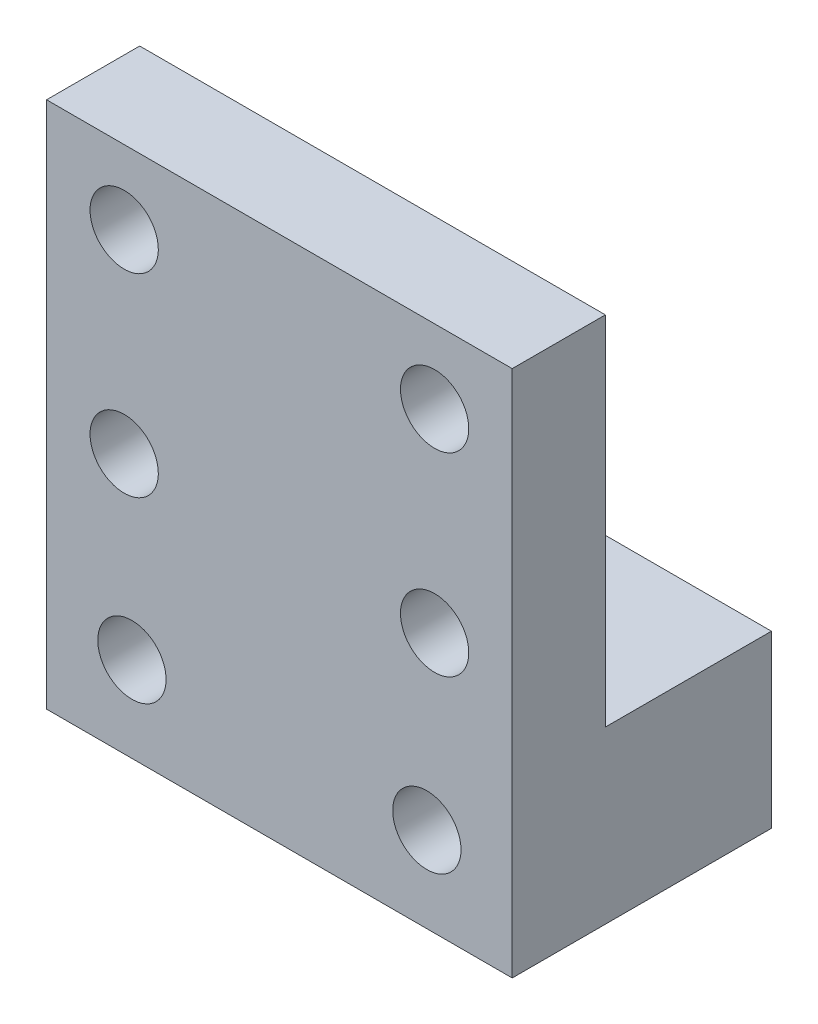
ISO-10303-21;
HEADER;
FILE_DESCRIPTION(('STEP AP214'),'2;1');
FILE_NAME('part.step','',(''),(''),'','','');
FILE_SCHEMA(('AUTOMOTIVE_DESIGN { 1 0 10303 214 1 1 1 1 }'));
ENDSEC;
DATA;
#1=APPLICATION_CONTEXT('core data for automotive mechanical design processes');
#2=APPLICATION_PROTOCOL_DEFINITION('international standard','automotive_design',2000,#1);
#3=PRODUCT_CONTEXT('',#1,'mechanical');
#4=PRODUCT('Part','Part','',(#3));
#5=PRODUCT_RELATED_PRODUCT_CATEGORY('part','',(#4));
#6=PRODUCT_DEFINITION_FORMATION('','',#4);
#7=PRODUCT_DEFINITION_CONTEXT('part definition',#1,'design');
#8=PRODUCT_DEFINITION('design','',#6,#7);
#9=PRODUCT_DEFINITION_SHAPE('','',#8);
#10=(LENGTH_UNIT() NAMED_UNIT(*) SI_UNIT(.MILLI.,.METRE.));
#11=(NAMED_UNIT(*) PLANE_ANGLE_UNIT() SI_UNIT($,.RADIAN.));
#12=(NAMED_UNIT(*) SI_UNIT($,.STERADIAN.) SOLID_ANGLE_UNIT());
#13=UNCERTAINTY_MEASURE_WITH_UNIT(LENGTH_MEASURE(1.E-05),#10,'distance_accuracy_value','');
#14=(GEOMETRIC_REPRESENTATION_CONTEXT(3) GLOBAL_UNCERTAINTY_ASSIGNED_CONTEXT((#13)) GLOBAL_UNIT_ASSIGNED_CONTEXT((#10,
#11,#12)) REPRESENTATION_CONTEXT('',''));
#15=CARTESIAN_POINT('',(0.,0.,0.));
#16=DIRECTION('',(0.,0.,1.));
#17=DIRECTION('',(1.,0.,0.));
#18=AXIS2_PLACEMENT_3D('',#15,#16,#17);
#19=CARTESIAN_POINT('',(-11.4999999999999,6.5,-25.0000000000001));
#20=DIRECTION('',(0.,-1.,0.));
#21=DIRECTION('',(0.,0.,-1.));
#22=AXIS2_PLACEMENT_3D('',#19,#20,#21);
#23=PLANE('',#22);
#24=DIRECTION('',(-1.,0.,0.));
#25=VECTOR('',#24,1.);
#26=CARTESIAN_POINT('',(-11.4999999999999,6.5,-14.3));
#27=LINE('',#26,#25);
#28=CARTESIAN_POINT('',(-28.9999999999999,6.5,-14.3));
#29=VERTEX_POINT('',#28);
#30=CARTESIAN_POINT('',(-41.5000000000001,6.5,-14.3));
#31=VERTEX_POINT('',#30);
#32=EDGE_CURVE('E126',#29,#31,#27,.T.);
#33=ORIENTED_EDGE('',*,*,#32,.F.);
#34=DIRECTION('',(0.,0.,-1.));
#35=VECTOR('',#34,1.);
#36=CARTESIAN_POINT('',(-28.9999999999999,6.5,-25.0000000000001));
#37=LINE('',#36,#35);
#38=CARTESIAN_POINT('',(-28.9999999999999,6.5,-21.0000000000001));
#39=VERTEX_POINT('',#38);
#40=EDGE_CURVE('E45',#29,#39,#37,.T.);
#41=ORIENTED_EDGE('',*,*,#40,.T.);
#42=DIRECTION('',(1.,0.,0.));
#43=VECTOR('',#42,1.);
#44=CARTESIAN_POINT('',(-11.4999999999999,6.5,-21.0000000000001));
#45=LINE('',#44,#43);
#46=CARTESIAN_POINT('',(-26.4999999999999,6.50000000000001,-21.0000000000001));
#47=VERTEX_POINT('',#46);
#48=EDGE_CURVE('E149',#39,#47,#45,.T.);
#49=ORIENTED_EDGE('',*,*,#48,.T.);
#50=CARTESIAN_POINT('',(-26.4999999999999,6.5,-25.0000000000001));
#51=DIRECTION('',(0.,-1.,0.));
#52=DIRECTION('',(0.,0.,-1.));
#53=AXIS2_PLACEMENT_3D('',#50,#51,#52);
#54=CIRCLE('',#53,4.00000000000001);
#55=CARTESIAN_POINT('',(-30.4999999999999,6.5,-25.0000000000001));
#56=VERTEX_POINT('',#55);
#57=EDGE_CURVE('E38',#47,#56,#54,.T.);
#58=ORIENTED_EDGE('',*,*,#57,.T.);
#59=DIRECTION('',(-1.,0.,0.));
#60=VECTOR('',#59,1.);
#61=CARTESIAN_POINT('',(-11.4999999999999,6.5,-25.0000000000001));
#62=LINE('',#61,#60);
#63=CARTESIAN_POINT('',(-41.5000000000001,6.5,-25.0000000000001));
#64=VERTEX_POINT('',#63);
#65=EDGE_CURVE('E207',#56,#64,#62,.T.);
#66=ORIENTED_EDGE('',*,*,#65,.T.);
#67=DIRECTION('',(0.,0.,1.));
#68=VECTOR('',#67,1.);
#69=CARTESIAN_POINT('',(-41.5000000000001,6.5,-25.0000000000001));
#70=LINE('',#69,#68);
#71=EDGE_CURVE('E194',#64,#31,#70,.T.);
#72=ORIENTED_EDGE('',*,*,#71,.T.);
#73=EDGE_LOOP('',(#33,#41,#49,#58,#66,#72));
#74=FACE_BOUND('',#73,.T.);
#75=ADVANCED_FACE('F30',(#74),#23,.F.);
#76=CARTESIAN_POINT('',(-11.4999999999999,6.5,-14.3));
#77=DIRECTION('',(0.,0.,1.));
#78=DIRECTION('',(0.,-1.,0.));
#79=AXIS2_PLACEMENT_3D('',#76,#77,#78);
#80=PLANE('',#79);
#81=CARTESIAN_POINT('',(-16.4999999999999,12.25,-14.3));
#82=DIRECTION('',(0.,0.,-1.));
#83=DIRECTION('',(0.,1.,0.));
#84=AXIS2_PLACEMENT_3D('',#81,#82,#83);
#85=CIRCLE('',#84,2.20000000000001);
#86=CARTESIAN_POINT('',(-16.4999999999999,14.45,-14.3));
#87=VERTEX_POINT('',#86);
#88=EDGE_CURVE('E188',#87,#87,#85,.T.);
#89=ORIENTED_EDGE('',*,*,#88,.F.);
#90=EDGE_LOOP('',(#89));
#91=FACE_BOUND('',#90,.T.);
#92=CARTESIAN_POINT('',(-16.4999999999999,24.75,-14.3));
#93=DIRECTION('',(0.,0.,-1.));
#94=DIRECTION('',(0.,1.,0.));
#95=AXIS2_PLACEMENT_3D('',#92,#93,#94);
#96=CIRCLE('',#95,2.20000000000001);
#97=CARTESIAN_POINT('',(-16.4999999999999,26.95,-14.3));
#98=VERTEX_POINT('',#97);
#99=EDGE_CURVE('E170',#98,#98,#96,.T.);
#100=ORIENTED_EDGE('',*,*,#99,.F.);
#101=EDGE_LOOP('',(#100));
#102=FACE_BOUND('',#101,.T.);
#103=DIRECTION('',(0.,-1.,0.));
#104=VECTOR('',#103,1.);
#105=CARTESIAN_POINT('',(-23.9999999999998,6.5,-14.3));
#106=LINE('',#105,#104);
#107=CARTESIAN_POINT('',(-23.9999999999998,29.5,-14.3));
#108=VERTEX_POINT('',#107);
#109=CARTESIAN_POINT('',(-23.9999999999998,6.5,-14.3));
#110=VERTEX_POINT('',#109);
#111=EDGE_CURVE('E120',#108,#110,#106,.T.);
#112=ORIENTED_EDGE('',*,*,#111,.F.);
#113=DIRECTION('',(-1.,0.,0.));
#114=VECTOR('',#113,1.);
#115=CARTESIAN_POINT('',(-11.4999999999999,29.5,-14.3));
#116=LINE('',#115,#114);
#117=CARTESIAN_POINT('',(-11.4999999999999,29.5,-14.3));
#118=VERTEX_POINT('',#117);
#119=EDGE_CURVE('E208',#118,#108,#116,.T.);
#120=ORIENTED_EDGE('',*,*,#119,.F.);
#121=DIRECTION('',(0.,1.,0.));
#122=VECTOR('',#121,1.);
#123=CARTESIAN_POINT('',(-11.4999999999999,6.5,-14.3));
#124=LINE('',#123,#122);
#125=CARTESIAN_POINT('',(-11.4999999999999,6.5,-14.3));
#126=VERTEX_POINT('',#125);
#127=EDGE_CURVE('E123',#126,#118,#124,.T.);
#128=ORIENTED_EDGE('',*,*,#127,.F.);
#129=EDGE_CURVE('E117',#126,#110,#27,.T.);
#130=ORIENTED_EDGE('',*,*,#129,.T.);
#131=EDGE_LOOP('',(#112,#120,#128,#130));
#132=FACE_BOUND('',#131,.T.);
#133=ADVANCED_FACE('F118',(#91,#102,#132),#80,.F.);
#134=CARTESIAN_POINT('',(-41.5000000000001,29.5,-25.0000000000001));
#135=DIRECTION('',(0.,0.,1.));
#136=DIRECTION('',(1.,0.,0.));
#137=AXIS2_PLACEMENT_3D('',#134,#135,#136);
#138=PLANE('',#137);
#139=CARTESIAN_POINT('',(-35.9999999999999,0.999999999999988,-25.0000000000001));
#140=DIRECTION('',(0.,0.,-1.));
#141=DIRECTION('',(0.,1.,0.));
#142=AXIS2_PLACEMENT_3D('',#139,#140,#141);
#143=CIRCLE('',#142,2.20000000000001);
#144=CARTESIAN_POINT('',(-35.9999999999999,3.2,-25.0000000000001));
#145=VERTEX_POINT('',#144);
#146=EDGE_CURVE('E164',#145,#145,#143,.T.);
#147=ORIENTED_EDGE('',*,*,#146,.F.);
#148=EDGE_LOOP('',(#147));
#149=FACE_BOUND('',#148,.T.);
#150=ORIENTED_EDGE('',*,*,#65,.F.);
#151=DIRECTION('',(0.,-1.,0.));
#152=VECTOR('',#151,1.);
#153=CARTESIAN_POINT('',(-30.4999999999999,-4.5,-25.0000000000001));
#154=LINE('',#153,#152);
#155=CARTESIAN_POINT('',(-30.4999999999999,-4.5,-25.0000000000001));
#156=VERTEX_POINT('',#155);
#157=EDGE_CURVE('E155',#56,#156,#154,.T.);
#158=ORIENTED_EDGE('',*,*,#157,.T.);
#159=DIRECTION('',(1.,0.,0.));
#160=VECTOR('',#159,1.);
#161=CARTESIAN_POINT('',(-41.5000000000001,-4.5,-25.0000000000001));
#162=LINE('',#161,#160);
#163=CARTESIAN_POINT('',(-41.5000000000001,-4.5,-25.0000000000001));
#164=VERTEX_POINT('',#163);
#165=EDGE_CURVE('E214',#164,#156,#162,.T.);
#166=ORIENTED_EDGE('',*,*,#165,.F.);
#167=DIRECTION('',(0.,-1.,0.));
#168=VECTOR('',#167,1.);
#169=CARTESIAN_POINT('',(-41.5000000000001,29.5,-25.0000000000001));
#170=LINE('',#169,#168);
#171=EDGE_CURVE('E210',#64,#164,#170,.T.);
#172=ORIENTED_EDGE('',*,*,#171,.F.);
#173=EDGE_LOOP('',(#150,#158,#166,#172));
#174=FACE_BOUND('',#173,.T.);
#175=ADVANCED_FACE('F268',(#149,#174),#138,.F.);
#176=CARTESIAN_POINT('',(-11.4999999999999,29.5,-25.0000000000001));
#177=DIRECTION('',(0.,1.,0.));
#178=DIRECTION('',(0.,0.,1.));
#179=AXIS2_PLACEMENT_3D('',#176,#177,#178);
#180=PLANE('',#179);
#181=DIRECTION('',(0.,0.,1.));
#182=VECTOR('',#181,1.);
#183=CARTESIAN_POINT('',(-41.5000000000001,29.5,-25.0000000000001));
#184=LINE('',#183,#182);
#185=CARTESIAN_POINT('',(-41.5000000000001,29.5,-14.3));
#186=VERTEX_POINT('',#185);
#187=CARTESIAN_POINT('',(-41.5000000000001,29.5,-8.29999999999999));
#188=VERTEX_POINT('',#187);
#189=EDGE_CURVE('E220',#186,#188,#184,.T.);
#190=ORIENTED_EDGE('',*,*,#189,.T.);
#191=DIRECTION('',(-1.,0.,0.));
#192=VECTOR('',#191,1.);
#193=CARTESIAN_POINT('',(-11.4999999999999,29.5,-8.29999999999999));
#194=LINE('',#193,#192);
#195=CARTESIAN_POINT('',(-11.4999999999999,29.5,-8.29999999999999));
#196=VERTEX_POINT('',#195);
#197=EDGE_CURVE('E206',#196,#188,#194,.T.);
#198=ORIENTED_EDGE('',*,*,#197,.F.);
#199=DIRECTION('',(0.,0.,1.));
#200=VECTOR('',#199,1.);
#201=CARTESIAN_POINT('',(-11.4999999999999,29.5,-25.0000000000001));
#202=LINE('',#201,#200);
#203=EDGE_CURVE('E229',#118,#196,#202,.T.);
#204=ORIENTED_EDGE('',*,*,#203,.F.);
#205=ORIENTED_EDGE('',*,*,#119,.T.);
#206=DIRECTION('',(-1.,0.,0.));
#207=VECTOR('',#206,1.);
#208=CARTESIAN_POINT('',(-11.4999999999999,29.5,-14.3));
#209=LINE('',#208,#207);
#210=CARTESIAN_POINT('',(-28.9999999999999,29.5,-14.3));
#211=VERTEX_POINT('',#210);
#212=EDGE_CURVE('E145',#108,#211,#209,.T.);
#213=ORIENTED_EDGE('',*,*,#212,.T.);
#214=EDGE_CURVE('E125',#211,#186,#116,.T.);
#215=ORIENTED_EDGE('',*,*,#214,.T.);
#216=EDGE_LOOP('',(#190,#198,#204,#205,#213,#215));
#217=FACE_BOUND('',#216,.T.);
#218=ADVANCED_FACE('F32',(#217),#180,.T.);
#219=CARTESIAN_POINT('',(-11.4999999999999,-4.5,-25.0000000000001));
#220=DIRECTION('',(1.,0.,0.));
#221=DIRECTION('',(0.,1.,0.));
#222=AXIS2_PLACEMENT_3D('',#219,#220,#221);
#223=PLANE('',#222);
#224=DIRECTION('',(0.,0.,1.));
#225=VECTOR('',#224,1.);
#226=CARTESIAN_POINT('',(-11.4999999999999,6.5,-25.0000000000001));
#227=LINE('',#226,#225);
#228=CARTESIAN_POINT('',(-11.4999999999999,6.5,-25.0000000000001));
#229=VERTEX_POINT('',#228);
#230=EDGE_CURVE('E195',#229,#126,#227,.T.);
#231=ORIENTED_EDGE('',*,*,#230,.T.);
#232=ORIENTED_EDGE('',*,*,#127,.T.);
#233=ORIENTED_EDGE('',*,*,#203,.T.);
#234=DIRECTION('',(0.,1.,0.));
#235=VECTOR('',#234,1.);
#236=CARTESIAN_POINT('',(-11.4999999999999,-4.5,-8.29999999999999));
#237=LINE('',#236,#235);
#238=CARTESIAN_POINT('',(-11.4999999999999,-4.5,-8.29999999999999));
#239=VERTEX_POINT('',#238);
#240=EDGE_CURVE('E213',#239,#196,#237,.T.);
#241=ORIENTED_EDGE('',*,*,#240,.F.);
#242=DIRECTION('',(0.,0.,1.));
#243=VECTOR('',#242,1.);
#244=CARTESIAN_POINT('',(-11.4999999999999,-4.5,-25.0000000000001));
#245=LINE('',#244,#243);
#246=CARTESIAN_POINT('',(-11.4999999999999,-4.5,-25.0000000000001));
#247=VERTEX_POINT('',#246);
#248=EDGE_CURVE('E231',#247,#239,#245,.T.);
#249=ORIENTED_EDGE('',*,*,#248,.F.);
#250=DIRECTION('',(0.,1.,0.));
#251=VECTOR('',#250,1.);
#252=CARTESIAN_POINT('',(-11.4999999999999,-4.5,-25.0000000000001));
#253=LINE('',#252,#251);
#254=EDGE_CURVE('E217',#247,#229,#253,.T.);
#255=ORIENTED_EDGE('',*,*,#254,.T.);
#256=EDGE_LOOP('',(#231,#232,#233,#241,#249,#255));
#257=FACE_BOUND('',#256,.T.);
#258=ADVANCED_FACE('F254',(#257),#223,.T.);
#259=CARTESIAN_POINT('',(-41.5000000000001,-4.5,-25.0000000000001));
#260=DIRECTION('',(0.,-1.,0.));
#261=DIRECTION('',(0.,0.,-1.));
#262=AXIS2_PLACEMENT_3D('',#259,#260,#261);
#263=PLANE('',#262);
#264=ORIENTED_EDGE('',*,*,#165,.T.);
#265=CARTESIAN_POINT('',(-26.4999999999999,-4.5,-25.0000000000001));
#266=DIRECTION('',(0.,-1.,0.));
#267=DIRECTION('',(0.,0.,-1.));
#268=AXIS2_PLACEMENT_3D('',#265,#266,#267);
#269=CIRCLE('',#268,4.00000000000001);
#270=CARTESIAN_POINT('',(-22.4999999999998,-4.5,-25.0000000000001));
#271=VERTEX_POINT('',#270);
#272=EDGE_CURVE('E150',#271,#156,#269,.T.);
#273=ORIENTED_EDGE('',*,*,#272,.F.);
#274=EDGE_CURVE('E212',#271,#247,#162,.T.);
#275=ORIENTED_EDGE('',*,*,#274,.T.);
#276=ORIENTED_EDGE('',*,*,#248,.T.);
#277=DIRECTION('',(1.,0.,0.));
#278=VECTOR('',#277,1.);
#279=CARTESIAN_POINT('',(-41.5000000000001,-4.5,-8.29999999999999));
#280=LINE('',#279,#278);
#281=CARTESIAN_POINT('',(-41.5000000000001,-4.5,-8.29999999999999));
#282=VERTEX_POINT('',#281);
#283=EDGE_CURVE('E225',#282,#239,#280,.T.);
#284=ORIENTED_EDGE('',*,*,#283,.F.);
#285=DIRECTION('',(0.,0.,1.));
#286=VECTOR('',#285,1.);
#287=CARTESIAN_POINT('',(-41.5000000000001,-4.5,-25.0000000000001));
#288=LINE('',#287,#286);
#289=EDGE_CURVE('E234',#164,#282,#288,.T.);
#290=ORIENTED_EDGE('',*,*,#289,.F.);
#291=EDGE_LOOP('',(#264,#273,#275,#276,#284,#290));
#292=FACE_BOUND('',#291,.T.);
#293=ADVANCED_FACE('F272',(#292),#263,.T.);
#294=CARTESIAN_POINT('',(-41.5000000000001,29.5,-25.0000000000001));
#295=DIRECTION('',(-1.,0.,0.));
#296=DIRECTION('',(0.,0.,1.));
#297=AXIS2_PLACEMENT_3D('',#294,#295,#296);
#298=PLANE('',#297);
#299=ORIENTED_EDGE('',*,*,#71,.F.);
#300=ORIENTED_EDGE('',*,*,#171,.T.);
#301=ORIENTED_EDGE('',*,*,#289,.T.);
#302=DIRECTION('',(0.,-1.,0.));
#303=VECTOR('',#302,1.);
#304=CARTESIAN_POINT('',(-41.5000000000001,29.5,-8.29999999999999));
#305=LINE('',#304,#303);
#306=EDGE_CURVE('E222',#188,#282,#305,.T.);
#307=ORIENTED_EDGE('',*,*,#306,.F.);
#308=ORIENTED_EDGE('',*,*,#189,.F.);
#309=DIRECTION('',(0.,1.,0.));
#310=VECTOR('',#309,1.);
#311=CARTESIAN_POINT('',(-41.5000000000001,6.5,-14.3));
#312=LINE('',#311,#310);
#313=EDGE_CURVE('E197',#31,#186,#312,.T.);
#314=ORIENTED_EDGE('',*,*,#313,.F.);
#315=EDGE_LOOP('',(#299,#300,#301,#307,#308,#314));
#316=FACE_BOUND('',#315,.T.);
#317=ADVANCED_FACE('F245',(#316),#298,.T.);
#318=CARTESIAN_POINT('',(-16.9999999999999,0.999999999999997,-25.0000000000001));
#319=DIRECTION('',(0.,0.,1.));
#320=DIRECTION('',(1.,0.,0.));
#321=AXIS2_PLACEMENT_3D('',#318,#319,#320);
#322=CIRCLE('',#321,2.20000000000001);
#323=CARTESIAN_POINT('',(-14.7999999999998,0.999999999999997,-25.0000000000001));
#324=VERTEX_POINT('',#323);
#325=EDGE_CURVE('E161',#324,#324,#322,.T.);
#326=ORIENTED_EDGE('',*,*,#325,.T.);
#327=EDGE_LOOP('',(#326));
#328=FACE_BOUND('',#327,.T.);
#329=ORIENTED_EDGE('',*,*,#274,.F.);
#330=DIRECTION('',(0.,-1.,0.));
#331=VECTOR('',#330,1.);
#332=CARTESIAN_POINT('',(-22.4999999999998,-4.5,-25.0000000000001));
#333=LINE('',#332,#331);
#334=CARTESIAN_POINT('',(-22.4999999999998,6.5,-25.0000000000001));
#335=VERTEX_POINT('',#334);
#336=EDGE_CURVE('E152',#271,#335,#333,.F.);
#337=ORIENTED_EDGE('',*,*,#336,.T.);
#338=EDGE_CURVE('E203',#229,#335,#62,.T.);
#339=ORIENTED_EDGE('',*,*,#338,.F.);
#340=ORIENTED_EDGE('',*,*,#254,.F.);
#341=EDGE_LOOP('',(#329,#337,#339,#340));
#342=FACE_BOUND('',#341,.T.);
#343=ADVANCED_FACE('F275',(#328,#342),#138,.F.);
#344=CARTESIAN_POINT('',(-41.5000000000001,29.5,-8.29999999999999));
#345=DIRECTION('',(0.,0.,1.));
#346=DIRECTION('',(1.,0.,0.));
#347=AXIS2_PLACEMENT_3D('',#344,#345,#346);
#348=PLANE('',#347);
#349=ORIENTED_EDGE('',*,*,#283,.T.);
#350=ORIENTED_EDGE('',*,*,#240,.T.);
#351=ORIENTED_EDGE('',*,*,#197,.T.);
#352=ORIENTED_EDGE('',*,*,#306,.T.);
#353=EDGE_LOOP('',(#349,#350,#351,#352));
#354=FACE_BOUND('',#353,.T.);
#355=CARTESIAN_POINT('',(-35.9999999999999,0.99999999999998,-8.29999999999998));
#356=DIRECTION('',(0.,0.,-1.));
#357=DIRECTION('',(0.,1.,0.));
#358=AXIS2_PLACEMENT_3D('',#355,#356,#357);
#359=CIRCLE('',#358,2.20000000000001);
#360=CARTESIAN_POINT('',(-35.9999999999999,3.19999999999999,-8.29999999999998));
#361=VERTEX_POINT('',#360);
#362=EDGE_CURVE('E167',#361,#361,#359,.T.);
#363=ORIENTED_EDGE('',*,*,#362,.T.);
#364=EDGE_LOOP('',(#363));
#365=FACE_BOUND('',#364,.T.);
#366=CARTESIAN_POINT('',(-36.4999999999999,24.75,-8.29999999999999));
#367=DIRECTION('',(0.,0.,-1.));
#368=DIRECTION('',(0.,1.,0.));
#369=AXIS2_PLACEMENT_3D('',#366,#367,#368);
#370=CIRCLE('',#369,2.20000000000001);
#371=CARTESIAN_POINT('',(-36.4999999999999,26.95,-8.29999999999999));
#372=VERTEX_POINT('',#371);
#373=EDGE_CURVE('E179',#372,#372,#370,.T.);
#374=ORIENTED_EDGE('',*,*,#373,.T.);
#375=EDGE_LOOP('',(#374));
#376=FACE_BOUND('',#375,.T.);
#377=CARTESIAN_POINT('',(-36.4999999999999,12.25,-8.29999999999999));
#378=DIRECTION('',(0.,0.,-1.));
#379=DIRECTION('',(0.,1.,0.));
#380=AXIS2_PLACEMENT_3D('',#377,#378,#379);
#381=CIRCLE('',#380,2.20000000000001);
#382=CARTESIAN_POINT('',(-36.4999999999999,14.45,-8.29999999999999));
#383=VERTEX_POINT('',#382);
#384=EDGE_CURVE('E185',#383,#383,#381,.T.);
#385=ORIENTED_EDGE('',*,*,#384,.T.);
#386=EDGE_LOOP('',(#385));
#387=FACE_BOUND('',#386,.T.);
#388=CARTESIAN_POINT('',(-16.4999999999999,12.25,-8.29999999999999));
#389=DIRECTION('',(0.,0.,-1.));
#390=DIRECTION('',(0.,1.,0.));
#391=AXIS2_PLACEMENT_3D('',#388,#389,#390);
#392=CIRCLE('',#391,2.20000000000001);
#393=CARTESIAN_POINT('',(-16.4999999999999,14.45,-8.29999999999999));
#394=VERTEX_POINT('',#393);
#395=EDGE_CURVE('E191',#394,#394,#392,.T.);
#396=ORIENTED_EDGE('',*,*,#395,.T.);
#397=EDGE_LOOP('',(#396));
#398=FACE_BOUND('',#397,.T.);
#399=CARTESIAN_POINT('',(-16.4999999999999,24.75,-8.29999999999999));
#400=DIRECTION('',(0.,0.,-1.));
#401=DIRECTION('',(0.,1.,0.));
#402=AXIS2_PLACEMENT_3D('',#399,#400,#401);
#403=CIRCLE('',#402,2.20000000000001);
#404=CARTESIAN_POINT('',(-16.4999999999999,26.95,-8.29999999999999));
#405=VERTEX_POINT('',#404);
#406=EDGE_CURVE('E173',#405,#405,#403,.T.);
#407=ORIENTED_EDGE('',*,*,#406,.T.);
#408=EDGE_LOOP('',(#407));
#409=FACE_BOUND('',#408,.T.);
#410=CARTESIAN_POINT('',(-16.9999999999999,0.999999999999997,-8.29999999999999));
#411=DIRECTION('',(0.,0.,1.));
#412=DIRECTION('',(1.,0.,0.));
#413=AXIS2_PLACEMENT_3D('',#410,#411,#412);
#414=CIRCLE('',#413,2.20000000000001);
#415=CARTESIAN_POINT('',(-14.7999999999998,0.999999999999997,-8.29999999999999));
#416=VERTEX_POINT('',#415);
#417=EDGE_CURVE('E158',#416,#416,#414,.T.);
#418=ORIENTED_EDGE('',*,*,#417,.F.);
#419=EDGE_LOOP('',(#418));
#420=FACE_BOUND('',#419,.T.);
#421=ADVANCED_FACE('F249',(#354,#365,#376,#387,#398,#409,#420),#348,.T.);
#422=EDGE_CURVE('E11',#335,#47,#54,.T.);
#423=ORIENTED_EDGE('',*,*,#422,.T.);
#424=CARTESIAN_POINT('',(-23.9999999999998,6.5,-21.0000000000001));
#425=VERTEX_POINT('',#424);
#426=EDGE_CURVE('E52',#47,#425,#45,.T.);
#427=ORIENTED_EDGE('',*,*,#426,.T.);
#428=DIRECTION('',(0.,0.,-1.));
#429=VECTOR('',#428,1.);
#430=CARTESIAN_POINT('',(-23.9999999999998,6.5,-25.0000000000001));
#431=LINE('',#430,#429);
#432=EDGE_CURVE('E128',#110,#425,#431,.T.);
#433=ORIENTED_EDGE('',*,*,#432,.F.);
#434=ORIENTED_EDGE('',*,*,#129,.F.);
#435=ORIENTED_EDGE('',*,*,#230,.F.);
#436=ORIENTED_EDGE('',*,*,#338,.T.);
#437=EDGE_LOOP('',(#423,#427,#433,#434,#435,#436));
#438=FACE_BOUND('',#437,.T.);
#439=ADVANCED_FACE('F129',(#438),#23,.F.);
#440=CARTESIAN_POINT('',(-36.4999999999999,24.75,-14.3));
#441=DIRECTION('',(0.,0.,-1.));
#442=DIRECTION('',(0.,1.,0.));
#443=AXIS2_PLACEMENT_3D('',#440,#441,#442);
#444=CIRCLE('',#443,2.20000000000001);
#445=CARTESIAN_POINT('',(-36.4999999999999,26.95,-14.3));
#446=VERTEX_POINT('',#445);
#447=EDGE_CURVE('E176',#446,#446,#444,.T.);
#448=ORIENTED_EDGE('',*,*,#447,.F.);
#449=EDGE_LOOP('',(#448));
#450=FACE_BOUND('',#449,.T.);
#451=CARTESIAN_POINT('',(-36.4999999999999,12.25,-14.3));
#452=DIRECTION('',(0.,0.,-1.));
#453=DIRECTION('',(0.,1.,0.));
#454=AXIS2_PLACEMENT_3D('',#451,#452,#453);
#455=CIRCLE('',#454,2.20000000000001);
#456=CARTESIAN_POINT('',(-36.4999999999999,14.45,-14.3));
#457=VERTEX_POINT('',#456);
#458=EDGE_CURVE('E182',#457,#457,#455,.T.);
#459=ORIENTED_EDGE('',*,*,#458,.F.);
#460=EDGE_LOOP('',(#459));
#461=FACE_BOUND('',#460,.T.);
#462=ORIENTED_EDGE('',*,*,#214,.F.);
#463=DIRECTION('',(0.,-1.,0.));
#464=VECTOR('',#463,1.);
#465=CARTESIAN_POINT('',(-28.9999999999999,6.5,-14.3));
#466=LINE('',#465,#464);
#467=EDGE_CURVE('E133',#211,#29,#466,.T.);
#468=ORIENTED_EDGE('',*,*,#467,.T.);
#469=ORIENTED_EDGE('',*,*,#32,.T.);
#470=ORIENTED_EDGE('',*,*,#313,.T.);
#471=EDGE_LOOP('',(#462,#468,#469,#470));
#472=FACE_BOUND('',#471,.T.);
#473=ADVANCED_FACE('F263',(#450,#461,#472),#80,.F.);
#474=CARTESIAN_POINT('',(-16.4999999999999,12.25,-14.3));
#475=DIRECTION('',(0.,0.,-1.));
#476=DIRECTION('',(0.,1.,0.));
#477=AXIS2_PLACEMENT_3D('',#474,#475,#476);
#478=CYLINDRICAL_SURFACE('',#477,2.20000000000001);
#479=ORIENTED_EDGE('',*,*,#395,.F.);
#480=EDGE_LOOP('',(#479));
#481=FACE_BOUND('',#480,.T.);
#482=ORIENTED_EDGE('',*,*,#88,.T.);
#483=EDGE_LOOP('',(#482));
#484=FACE_BOUND('',#483,.T.);
#485=ADVANCED_FACE('F293',(#481,#484),#478,.F.);
#486=CARTESIAN_POINT('',(-36.4999999999999,12.25,-14.3));
#487=DIRECTION('',(0.,0.,-1.));
#488=DIRECTION('',(0.,1.,0.));
#489=AXIS2_PLACEMENT_3D('',#486,#487,#488);
#490=CYLINDRICAL_SURFACE('',#489,2.20000000000001);
#491=ORIENTED_EDGE('',*,*,#384,.F.);
#492=EDGE_LOOP('',(#491));
#493=FACE_BOUND('',#492,.T.);
#494=ORIENTED_EDGE('',*,*,#458,.T.);
#495=EDGE_LOOP('',(#494));
#496=FACE_BOUND('',#495,.T.);
#497=ADVANCED_FACE('F410',(#493,#496),#490,.F.);
#498=CARTESIAN_POINT('',(-36.4999999999999,24.75,-14.3));
#499=DIRECTION('',(0.,0.,-1.));
#500=DIRECTION('',(0.,1.,0.));
#501=AXIS2_PLACEMENT_3D('',#498,#499,#500);
#502=CYLINDRICAL_SURFACE('',#501,2.20000000000001);
#503=ORIENTED_EDGE('',*,*,#373,.F.);
#504=EDGE_LOOP('',(#503));
#505=FACE_BOUND('',#504,.T.);
#506=ORIENTED_EDGE('',*,*,#447,.T.);
#507=EDGE_LOOP('',(#506));
#508=FACE_BOUND('',#507,.T.);
#509=ADVANCED_FACE('F406',(#505,#508),#502,.F.);
#510=CARTESIAN_POINT('',(-16.4999999999999,24.75,-14.3));
#511=DIRECTION('',(0.,0.,-1.));
#512=DIRECTION('',(0.,1.,0.));
#513=AXIS2_PLACEMENT_3D('',#510,#511,#512);
#514=CYLINDRICAL_SURFACE('',#513,2.20000000000001);
#515=ORIENTED_EDGE('',*,*,#406,.F.);
#516=EDGE_LOOP('',(#515));
#517=FACE_BOUND('',#516,.T.);
#518=ORIENTED_EDGE('',*,*,#99,.T.);
#519=EDGE_LOOP('',(#518));
#520=FACE_BOUND('',#519,.T.);
#521=ADVANCED_FACE('F402',(#517,#520),#514,.F.);
#522=CARTESIAN_POINT('',(-35.9999999999999,0.999999999999988,-25.0000000000001));
#523=DIRECTION('',(0.,0.,-1.));
#524=DIRECTION('',(0.,1.,0.));
#525=AXIS2_PLACEMENT_3D('',#522,#523,#524);
#526=CYLINDRICAL_SURFACE('',#525,2.20000000000001);
#527=ORIENTED_EDGE('',*,*,#362,.F.);
#528=EDGE_LOOP('',(#527));
#529=FACE_BOUND('',#528,.T.);
#530=ORIENTED_EDGE('',*,*,#146,.T.);
#531=EDGE_LOOP('',(#530));
#532=FACE_BOUND('',#531,.T.);
#533=ADVANCED_FACE('F398',(#529,#532),#526,.F.);
#534=CARTESIAN_POINT('',(-16.9999999999999,0.999999999999997,-8.29999999999999));
#535=DIRECTION('',(0.,0.,1.));
#536=DIRECTION('',(1.,0.,0.));
#537=AXIS2_PLACEMENT_3D('',#534,#535,#536);
#538=CYLINDRICAL_SURFACE('',#537,2.20000000000001);
#539=ORIENTED_EDGE('',*,*,#325,.F.);
#540=EDGE_LOOP('',(#539));
#541=FACE_BOUND('',#540,.T.);
#542=ORIENTED_EDGE('',*,*,#417,.T.);
#543=EDGE_LOOP('',(#542));
#544=FACE_BOUND('',#543,.T.);
#545=ADVANCED_FACE('F368',(#541,#544),#538,.F.);
#546=CARTESIAN_POINT('',(-26.4999999999999,-4.5,-25.0000000000001));
#547=DIRECTION('',(0.,-1.,0.));
#548=DIRECTION('',(0.,0.,-1.));
#549=AXIS2_PLACEMENT_3D('',#546,#547,#548);
#550=CYLINDRICAL_SURFACE('',#549,4.00000000000001);
#551=ORIENTED_EDGE('',*,*,#57,.F.);
#552=ORIENTED_EDGE('',*,*,#422,.F.);
#553=ORIENTED_EDGE('',*,*,#336,.F.);
#554=ORIENTED_EDGE('',*,*,#272,.T.);
#555=ORIENTED_EDGE('',*,*,#157,.F.);
#556=EDGE_LOOP('',(#551,#552,#553,#554,#555));
#557=FACE_BOUND('',#556,.T.);
#558=ADVANCED_FACE('F279',(#557),#550,.F.);
#559=CARTESIAN_POINT('',(-26.4999999999999,29.5,-14.3));
#560=DIRECTION('',(0.,0.279679396660933,-0.960093451224086));
#561=DIRECTION('',(0.,-0.960093451224086,-0.279679396660933));
#562=AXIS2_PLACEMENT_3D('',#559,#560,#561);
#563=PLANE('',#562);
#564=ORIENTED_EDGE('',*,*,#48,.F.);
#565=DIRECTION('',(0.,-0.960093451224086,-0.279679396660933));
#566=VECTOR('',#565,1.);
#567=CARTESIAN_POINT('',(-28.9999999999999,29.5,-14.3));
#568=LINE('',#567,#566);
#569=EDGE_CURVE('E137',#211,#39,#568,.T.);
#570=ORIENTED_EDGE('',*,*,#569,.F.);
#571=ORIENTED_EDGE('',*,*,#212,.F.);
#572=DIRECTION('',(0.,-0.960093451224086,-0.279679396660933));
#573=VECTOR('',#572,1.);
#574=CARTESIAN_POINT('',(-23.9999999999998,29.5,-14.3));
#575=LINE('',#574,#573);
#576=EDGE_CURVE('E136',#108,#425,#575,.T.);
#577=ORIENTED_EDGE('',*,*,#576,.T.);
#578=ORIENTED_EDGE('',*,*,#426,.F.);
#579=EDGE_LOOP('',(#564,#570,#571,#577,#578));
#580=FACE_BOUND('',#579,.T.);
#581=ADVANCED_FACE('F259',(#580),#563,.T.);
#582=CARTESIAN_POINT('',(-28.9999999999999,12.5,-16.65));
#583=DIRECTION('',(-1.,0.,0.));
#584=DIRECTION('',(0.,0.,1.));
#585=AXIS2_PLACEMENT_3D('',#582,#583,#584);
#586=PLANE('',#585);
#587=ORIENTED_EDGE('',*,*,#467,.F.);
#588=ORIENTED_EDGE('',*,*,#569,.T.);
#589=ORIENTED_EDGE('',*,*,#40,.F.);
#590=EDGE_LOOP('',(#587,#588,#589));
#591=FACE_BOUND('',#590,.T.);
#592=ADVANCED_FACE('F261',(#591),#586,.T.);
#593=CARTESIAN_POINT('',(-23.9999999999998,12.5,-16.65));
#594=DIRECTION('',(-1.,0.,0.));
#595=DIRECTION('',(0.,0.,1.));
#596=AXIS2_PLACEMENT_3D('',#593,#594,#595);
#597=PLANE('',#596);
#598=ORIENTED_EDGE('',*,*,#111,.T.);
#599=ORIENTED_EDGE('',*,*,#432,.T.);
#600=ORIENTED_EDGE('',*,*,#576,.F.);
#601=EDGE_LOOP('',(#598,#599,#600));
#602=FACE_BOUND('',#601,.T.);
#603=ADVANCED_FACE('F135',(#602),#597,.F.);
#604=CLOSED_SHELL('',(#75,#133,#175,#218,#258,#293,#317,#343,#421,#439,#473,#485,#497,#509,#521,
#533,#545,#558,#581,#592,#603));
#605=MANIFOLD_SOLID_BREP('B2',#604);
#606=ADVANCED_BREP_SHAPE_REPRESENTATION('',(#18,#605),#14);
#607=SHAPE_DEFINITION_REPRESENTATION(#9,#606);
ENDSEC;
END-ISO-10303-21;
